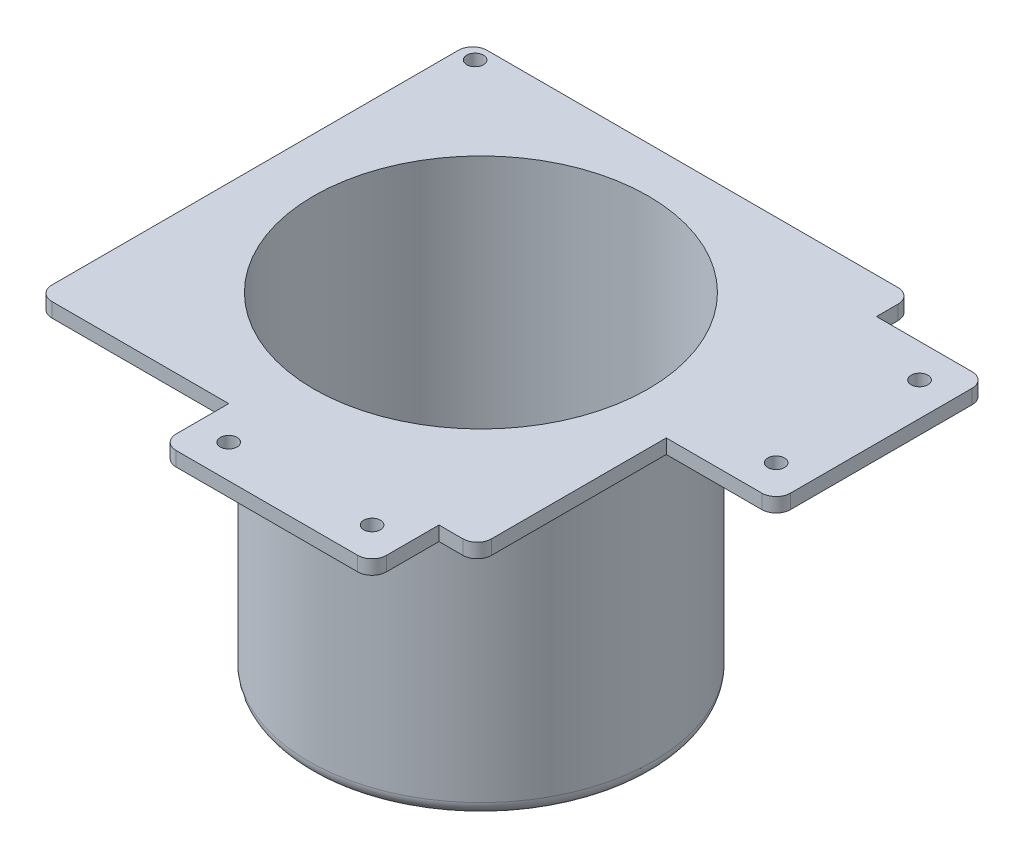
ISO-10303-21;
HEADER;
FILE_DESCRIPTION(('STEP AP214'),'2;1');
FILE_NAME('part.step','',(''),(''),'','','');
FILE_SCHEMA(('AUTOMOTIVE_DESIGN { 1 0 10303 214 1 1 1 1 }'));
ENDSEC;
DATA;
#1=APPLICATION_CONTEXT('core data for automotive mechanical design processes');
#2=APPLICATION_PROTOCOL_DEFINITION('international standard','automotive_design',2000,#1);
#3=PRODUCT_CONTEXT('',#1,'mechanical');
#4=PRODUCT('Part','Part','',(#3));
#5=PRODUCT_RELATED_PRODUCT_CATEGORY('part','',(#4));
#6=PRODUCT_DEFINITION_FORMATION('','',#4);
#7=PRODUCT_DEFINITION_CONTEXT('part definition',#1,'design');
#8=PRODUCT_DEFINITION('design','',#6,#7);
#9=PRODUCT_DEFINITION_SHAPE('','',#8);
#10=(LENGTH_UNIT() NAMED_UNIT(*) SI_UNIT(.MILLI.,.METRE.));
#11=(NAMED_UNIT(*) PLANE_ANGLE_UNIT() SI_UNIT($,.RADIAN.));
#12=(NAMED_UNIT(*) SI_UNIT($,.STERADIAN.) SOLID_ANGLE_UNIT());
#13=UNCERTAINTY_MEASURE_WITH_UNIT(LENGTH_MEASURE(1.E-05),#10,'distance_accuracy_value','');
#14=(GEOMETRIC_REPRESENTATION_CONTEXT(3) GLOBAL_UNCERTAINTY_ASSIGNED_CONTEXT((#13)) GLOBAL_UNIT_ASSIGNED_CONTEXT((#10,
#11,#12)) REPRESENTATION_CONTEXT('',''));
#15=CARTESIAN_POINT('',(0.,0.,0.));
#16=DIRECTION('',(0.,0.,1.));
#17=DIRECTION('',(1.,0.,0.));
#18=AXIS2_PLACEMENT_3D('',#15,#16,#17);
#19=CARTESIAN_POINT('',(0.,-3.,-91.06));
#20=DIRECTION('',(0.,0.,-1.));
#21=DIRECTION('',(-1.,0.,0.));
#22=AXIS2_PLACEMENT_3D('',#19,#20,#21);
#23=PLANE('',#22);
#24=DIRECTION('',(-1.,0.,0.));
#25=VECTOR('',#24,1.);
#26=CARTESIAN_POINT('',(0.,0.,-91.06));
#27=LINE('',#26,#25);
#28=CARTESIAN_POINT('',(89.,0.,-91.06));
#29=VERTEX_POINT('',#28);
#30=CARTESIAN_POINT('',(3.,0.,-91.06));
#31=VERTEX_POINT('',#30);
#32=EDGE_CURVE('E228',#29,#31,#27,.T.);
#33=ORIENTED_EDGE('',*,*,#32,.F.);
#34=DIRECTION('',(0.,1.,0.));
#35=VECTOR('',#34,1.);
#36=CARTESIAN_POINT('',(89.,-3.,-91.06));
#37=LINE('',#36,#35);
#38=CARTESIAN_POINT('',(89.,-3.,-91.06));
#39=VERTEX_POINT('',#38);
#40=EDGE_CURVE('E54',#29,#39,#37,.F.);
#41=ORIENTED_EDGE('',*,*,#40,.T.);
#42=DIRECTION('',(-1.,0.,0.));
#43=VECTOR('',#42,1.);
#44=CARTESIAN_POINT('',(0.,-3.,-91.06));
#45=LINE('',#44,#43);
#46=CARTESIAN_POINT('',(3.,-3.,-91.06));
#47=VERTEX_POINT('',#46);
#48=EDGE_CURVE('E257',#39,#47,#45,.T.);
#49=ORIENTED_EDGE('',*,*,#48,.T.);
#50=DIRECTION('',(0.,1.,0.));
#51=VECTOR('',#50,1.);
#52=CARTESIAN_POINT('',(3.,-3.,-91.06));
#53=LINE('',#52,#51);
#54=EDGE_CURVE('E261',#47,#31,#53,.T.);
#55=ORIENTED_EDGE('',*,*,#54,.T.);
#56=EDGE_LOOP('',(#33,#41,#49,#55));
#57=FACE_BOUND('',#56,.T.);
#58=ADVANCED_FACE('F39',(#57),#23,.T.);
#59=CARTESIAN_POINT('',(92.,-3.,-91.06));
#60=DIRECTION('',(1.,0.,0.));
#61=DIRECTION('',(0.,0.,-1.));
#62=AXIS2_PLACEMENT_3D('',#59,#60,#61);
#63=PLANE('',#62);
#64=DIRECTION('',(0.,0.,-1.));
#65=VECTOR('',#64,1.);
#66=CARTESIAN_POINT('',(92.,-3.,-91.06));
#67=LINE('',#66,#65);
#68=CARTESIAN_POINT('',(92.,-3.,-83.56));
#69=VERTEX_POINT('',#68);
#70=CARTESIAN_POINT('',(92.,-3.,-88.06));
#71=VERTEX_POINT('',#70);
#72=EDGE_CURVE('E198',#69,#71,#67,.T.);
#73=ORIENTED_EDGE('',*,*,#72,.T.);
#74=DIRECTION('',(0.,1.,0.));
#75=VECTOR('',#74,1.);
#76=CARTESIAN_POINT('',(92.,-3.,-88.06));
#77=LINE('',#76,#75);
#78=CARTESIAN_POINT('',(92.,0.,-88.06));
#79=VERTEX_POINT('',#78);
#80=EDGE_CURVE('E327',#71,#79,#77,.T.);
#81=ORIENTED_EDGE('',*,*,#80,.T.);
#82=DIRECTION('',(0.,0.,-1.));
#83=VECTOR('',#82,1.);
#84=CARTESIAN_POINT('',(92.,0.,-91.06));
#85=LINE('',#84,#83);
#86=CARTESIAN_POINT('',(92.,0.,-83.56));
#87=VERTEX_POINT('',#86);
#88=EDGE_CURVE('E255',#87,#79,#85,.T.);
#89=ORIENTED_EDGE('',*,*,#88,.F.);
#90=DIRECTION('',(0.,1.,0.));
#91=VECTOR('',#90,1.);
#92=CARTESIAN_POINT('',(92.,-3.,-83.56));
#93=LINE('',#92,#91);
#94=EDGE_CURVE('E258',#69,#87,#93,.T.);
#95=ORIENTED_EDGE('',*,*,#94,.F.);
#96=EDGE_LOOP('',(#73,#81,#89,#95));
#97=FACE_BOUND('',#96,.T.);
#98=ADVANCED_FACE('F352',(#97),#63,.T.);
#99=CARTESIAN_POINT('',(92.,-3.,-83.56));
#100=DIRECTION('',(0.,0.,-1.));
#101=DIRECTION('',(-1.,0.,0.));
#102=AXIS2_PLACEMENT_3D('',#99,#100,#101);
#103=PLANE('',#102);
#104=DIRECTION('',(-1.,0.,0.));
#105=VECTOR('',#104,1.);
#106=CARTESIAN_POINT('',(92.,0.,-83.56));
#107=LINE('',#106,#105);
#108=CARTESIAN_POINT('',(112.,0.,-83.56));
#109=VERTEX_POINT('',#108);
#110=EDGE_CURVE('E253',#109,#87,#107,.T.);
#111=ORIENTED_EDGE('',*,*,#110,.F.);
#112=DIRECTION('',(0.,1.,0.));
#113=VECTOR('',#112,1.);
#114=CARTESIAN_POINT('',(112.,-3.,-83.56));
#115=LINE('',#114,#113);
#116=CARTESIAN_POINT('',(112.,-3.,-83.56));
#117=VERTEX_POINT('',#116);
#118=EDGE_CURVE('E323',#109,#117,#115,.F.);
#119=ORIENTED_EDGE('',*,*,#118,.T.);
#120=DIRECTION('',(-1.,0.,0.));
#121=VECTOR('',#120,1.);
#122=CARTESIAN_POINT('',(92.,-3.,-83.56));
#123=LINE('',#122,#121);
#124=EDGE_CURVE('E224',#117,#69,#123,.T.);
#125=ORIENTED_EDGE('',*,*,#124,.T.);
#126=ORIENTED_EDGE('',*,*,#94,.T.);
#127=EDGE_LOOP('',(#111,#119,#125,#126));
#128=FACE_BOUND('',#127,.T.);
#129=ADVANCED_FACE('F358',(#128),#103,.T.);
#130=CARTESIAN_POINT('',(115.,-3.,-83.56));
#131=DIRECTION('',(1.,0.,0.));
#132=DIRECTION('',(0.,0.,-1.));
#133=AXIS2_PLACEMENT_3D('',#130,#131,#132);
#134=PLANE('',#133);
#135=DIRECTION('',(0.,0.,-1.));
#136=VECTOR('',#135,1.);
#137=CARTESIAN_POINT('',(115.,-3.,-83.56));
#138=LINE('',#137,#136);
#139=CARTESIAN_POINT('',(115.,-3.,-42.56));
#140=VERTEX_POINT('',#139);
#141=CARTESIAN_POINT('',(115.,-3.,-80.56));
#142=VERTEX_POINT('',#141);
#143=EDGE_CURVE('E221',#140,#142,#138,.T.);
#144=ORIENTED_EDGE('',*,*,#143,.T.);
#145=DIRECTION('',(0.,1.,0.));
#146=VECTOR('',#145,1.);
#147=CARTESIAN_POINT('',(115.,-3.,-80.56));
#148=LINE('',#147,#146);
#149=CARTESIAN_POINT('',(115.,0.,-80.56));
#150=VERTEX_POINT('',#149);
#151=EDGE_CURVE('E318',#142,#150,#148,.T.);
#152=ORIENTED_EDGE('',*,*,#151,.T.);
#153=DIRECTION('',(0.,0.,-1.));
#154=VECTOR('',#153,1.);
#155=CARTESIAN_POINT('',(115.,0.,-83.56));
#156=LINE('',#155,#154);
#157=CARTESIAN_POINT('',(115.,0.,-42.56));
#158=VERTEX_POINT('',#157);
#159=EDGE_CURVE('E250',#158,#150,#156,.T.);
#160=ORIENTED_EDGE('',*,*,#159,.F.);
#161=DIRECTION('',(0.,1.,0.));
#162=VECTOR('',#161,1.);
#163=CARTESIAN_POINT('',(115.,-3.,-42.56));
#164=LINE('',#163,#162);
#165=EDGE_CURVE('E314',#158,#140,#164,.F.);
#166=ORIENTED_EDGE('',*,*,#165,.T.);
#167=EDGE_LOOP('',(#144,#152,#160,#166));
#168=FACE_BOUND('',#167,.T.);
#169=ADVANCED_FACE('F411',(#168),#134,.T.);
#170=CARTESIAN_POINT('',(115.,-3.,-39.56));
#171=DIRECTION('',(0.,0.,1.));
#172=DIRECTION('',(1.,0.,0.));
#173=AXIS2_PLACEMENT_3D('',#170,#171,#172);
#174=PLANE('',#173);
#175=DIRECTION('',(1.,0.,0.));
#176=VECTOR('',#175,1.);
#177=CARTESIAN_POINT('',(115.,-3.,-39.56));
#178=LINE('',#177,#176);
#179=CARTESIAN_POINT('',(92.,-3.,-39.56));
#180=VERTEX_POINT('',#179);
#181=CARTESIAN_POINT('',(112.,-3.,-39.56));
#182=VERTEX_POINT('',#181);
#183=EDGE_CURVE('E218',#180,#182,#178,.T.);
#184=ORIENTED_EDGE('',*,*,#183,.T.);
#185=DIRECTION('',(0.,1.,0.));
#186=VECTOR('',#185,1.);
#187=CARTESIAN_POINT('',(112.,-3.,-39.56));
#188=LINE('',#187,#186);
#189=CARTESIAN_POINT('',(112.,0.,-39.56));
#190=VERTEX_POINT('',#189);
#191=EDGE_CURVE('E309',#182,#190,#188,.T.);
#192=ORIENTED_EDGE('',*,*,#191,.T.);
#193=DIRECTION('',(1.,0.,0.));
#194=VECTOR('',#193,1.);
#195=CARTESIAN_POINT('',(115.,0.,-39.56));
#196=LINE('',#195,#194);
#197=CARTESIAN_POINT('',(92.,0.,-39.56));
#198=VERTEX_POINT('',#197);
#199=EDGE_CURVE('E247',#198,#190,#196,.T.);
#200=ORIENTED_EDGE('',*,*,#199,.F.);
#201=DIRECTION('',(0.,1.,0.));
#202=VECTOR('',#201,1.);
#203=CARTESIAN_POINT('',(92.,-3.,-39.56));
#204=LINE('',#203,#202);
#205=EDGE_CURVE('E262',#180,#198,#204,.T.);
#206=ORIENTED_EDGE('',*,*,#205,.F.);
#207=EDGE_LOOP('',(#184,#192,#200,#206));
#208=FACE_BOUND('',#207,.T.);
#209=ADVANCED_FACE('F419',(#208),#174,.T.);
#210=CARTESIAN_POINT('',(92.,-3.,-39.56));
#211=DIRECTION('',(1.,0.,0.));
#212=DIRECTION('',(0.,0.,-1.));
#213=AXIS2_PLACEMENT_3D('',#210,#211,#212);
#214=PLANE('',#213);
#215=DIRECTION('',(0.,0.,-1.));
#216=VECTOR('',#215,1.);
#217=CARTESIAN_POINT('',(92.,0.,-39.56));
#218=LINE('',#217,#216);
#219=CARTESIAN_POINT('',(92.,0.,-3.00000000000002));
#220=VERTEX_POINT('',#219);
#221=EDGE_CURVE('E245',#220,#198,#218,.T.);
#222=ORIENTED_EDGE('',*,*,#221,.F.);
#223=DIRECTION('',(0.,1.,0.));
#224=VECTOR('',#223,1.);
#225=CARTESIAN_POINT('',(92.,-3.,-3.));
#226=LINE('',#225,#224);
#227=CARTESIAN_POINT('',(92.,-3.,-3.00000000000002));
#228=VERTEX_POINT('',#227);
#229=EDGE_CURVE('E296',#220,#228,#226,.F.);
#230=ORIENTED_EDGE('',*,*,#229,.T.);
#231=DIRECTION('',(0.,0.,-1.));
#232=VECTOR('',#231,1.);
#233=CARTESIAN_POINT('',(92.,-3.,-39.56));
#234=LINE('',#233,#232);
#235=EDGE_CURVE('E216',#228,#180,#234,.T.);
#236=ORIENTED_EDGE('',*,*,#235,.T.);
#237=ORIENTED_EDGE('',*,*,#205,.T.);
#238=EDGE_LOOP('',(#222,#230,#236,#237));
#239=FACE_BOUND('',#238,.T.);
#240=ADVANCED_FACE('F510',(#239),#214,.T.);
#241=CARTESIAN_POINT('',(84.,-3.,0.));
#242=DIRECTION('',(0.,0.,1.));
#243=DIRECTION('',(1.,0.,0.));
#244=AXIS2_PLACEMENT_3D('',#241,#242,#243);
#245=PLANE('',#244);
#246=DIRECTION('',(1.,0.,0.));
#247=VECTOR('',#246,1.);
#248=CARTESIAN_POINT('',(84.,-3.,0.));
#249=LINE('',#248,#247);
#250=CARTESIAN_POINT('',(84.,-3.,0.));
#251=VERTEX_POINT('',#250);
#252=CARTESIAN_POINT('',(89.,-3.,0.));
#253=VERTEX_POINT('',#252);
#254=EDGE_CURVE('E213',#251,#253,#249,.T.);
#255=ORIENTED_EDGE('',*,*,#254,.T.);
#256=DIRECTION('',(0.,1.,0.));
#257=VECTOR('',#256,1.);
#258=CARTESIAN_POINT('',(89.,-3.,0.));
#259=LINE('',#258,#257);
#260=CARTESIAN_POINT('',(89.,0.,0.));
#261=VERTEX_POINT('',#260);
#262=EDGE_CURVE('E291',#253,#261,#259,.T.);
#263=ORIENTED_EDGE('',*,*,#262,.T.);
#264=DIRECTION('',(1.,0.,0.));
#265=VECTOR('',#264,1.);
#266=CARTESIAN_POINT('',(84.,0.,0.));
#267=LINE('',#266,#265);
#268=CARTESIAN_POINT('',(84.,0.,0.));
#269=VERTEX_POINT('',#268);
#270=EDGE_CURVE('E242',#269,#261,#267,.T.);
#271=ORIENTED_EDGE('',*,*,#270,.F.);
#272=DIRECTION('',(0.,1.,0.));
#273=VECTOR('',#272,1.);
#274=CARTESIAN_POINT('',(84.,-3.,0.));
#275=LINE('',#274,#273);
#276=EDGE_CURVE('E197',#251,#269,#275,.T.);
#277=ORIENTED_EDGE('',*,*,#276,.F.);
#278=EDGE_LOOP('',(#255,#263,#271,#277));
#279=FACE_BOUND('',#278,.T.);
#280=ADVANCED_FACE('F430',(#279),#245,.T.);
#281=CARTESIAN_POINT('',(84.,-3.,0.));
#282=DIRECTION('',(1.,0.,0.));
#283=DIRECTION('',(0.,0.,-1.));
#284=AXIS2_PLACEMENT_3D('',#281,#282,#283);
#285=PLANE('',#284);
#286=DIRECTION('',(0.,0.,-1.));
#287=VECTOR('',#286,1.);
#288=CARTESIAN_POINT('',(84.,0.,0.));
#289=LINE('',#288,#287);
#290=CARTESIAN_POINT('',(84.,0.,11.));
#291=VERTEX_POINT('',#290);
#292=EDGE_CURVE('E240',#291,#269,#289,.T.);
#293=ORIENTED_EDGE('',*,*,#292,.F.);
#294=DIRECTION('',(0.,1.,0.));
#295=VECTOR('',#294,1.);
#296=CARTESIAN_POINT('',(84.,-3.,11.));
#297=LINE('',#296,#295);
#298=CARTESIAN_POINT('',(84.,-3.,11.));
#299=VERTEX_POINT('',#298);
#300=EDGE_CURVE('E305',#291,#299,#297,.F.);
#301=ORIENTED_EDGE('',*,*,#300,.T.);
#302=DIRECTION('',(0.,0.,-1.));
#303=VECTOR('',#302,1.);
#304=CARTESIAN_POINT('',(84.,-3.,0.));
#305=LINE('',#304,#303);
#306=EDGE_CURVE('E208',#299,#251,#305,.T.);
#307=ORIENTED_EDGE('',*,*,#306,.T.);
#308=ORIENTED_EDGE('',*,*,#276,.T.);
#309=EDGE_LOOP('',(#293,#301,#307,#308));
#310=FACE_BOUND('',#309,.T.);
#311=ADVANCED_FACE('F436',(#310),#285,.T.);
#312=CARTESIAN_POINT('',(40.,-3.,14.));
#313=DIRECTION('',(0.,0.,1.));
#314=DIRECTION('',(1.,0.,0.));
#315=AXIS2_PLACEMENT_3D('',#312,#313,#314);
#316=PLANE('',#315);
#317=DIRECTION('',(1.,0.,0.));
#318=VECTOR('',#317,1.);
#319=CARTESIAN_POINT('',(40.,-3.,14.));
#320=LINE('',#319,#318);
#321=CARTESIAN_POINT('',(43.,-3.,14.));
#322=VERTEX_POINT('',#321);
#323=CARTESIAN_POINT('',(81.,-3.,14.));
#324=VERTEX_POINT('',#323);
#325=EDGE_CURVE('E205',#322,#324,#320,.T.);
#326=ORIENTED_EDGE('',*,*,#325,.T.);
#327=DIRECTION('',(0.,1.,0.));
#328=VECTOR('',#327,1.);
#329=CARTESIAN_POINT('',(81.,-3.,14.));
#330=LINE('',#329,#328);
#331=CARTESIAN_POINT('',(81.,0.,14.));
#332=VERTEX_POINT('',#331);
#333=EDGE_CURVE('E300',#324,#332,#330,.T.);
#334=ORIENTED_EDGE('',*,*,#333,.T.);
#335=DIRECTION('',(1.,0.,0.));
#336=VECTOR('',#335,1.);
#337=CARTESIAN_POINT('',(40.,0.,14.));
#338=LINE('',#337,#336);
#339=CARTESIAN_POINT('',(43.,0.,14.));
#340=VERTEX_POINT('',#339);
#341=EDGE_CURVE('E237',#340,#332,#338,.T.);
#342=ORIENTED_EDGE('',*,*,#341,.F.);
#343=DIRECTION('',(0.,1.,0.));
#344=VECTOR('',#343,1.);
#345=CARTESIAN_POINT('',(43.,-3.,14.));
#346=LINE('',#345,#344);
#347=EDGE_CURVE('E280',#340,#322,#346,.F.);
#348=ORIENTED_EDGE('',*,*,#347,.T.);
#349=EDGE_LOOP('',(#326,#334,#342,#348));
#350=FACE_BOUND('',#349,.T.);
#351=ADVANCED_FACE('F442',(#350),#316,.T.);
#352=CARTESIAN_POINT('',(40.,-3.,0.));
#353=DIRECTION('',(-1.,0.,0.));
#354=DIRECTION('',(0.,0.,1.));
#355=AXIS2_PLACEMENT_3D('',#352,#353,#354);
#356=PLANE('',#355);
#357=DIRECTION('',(0.,0.,1.));
#358=VECTOR('',#357,1.);
#359=CARTESIAN_POINT('',(40.,-3.,0.));
#360=LINE('',#359,#358);
#361=CARTESIAN_POINT('',(40.,-3.,0.));
#362=VERTEX_POINT('',#361);
#363=CARTESIAN_POINT('',(40.,-3.,11.));
#364=VERTEX_POINT('',#363);
#365=EDGE_CURVE('E187',#362,#364,#360,.T.);
#366=ORIENTED_EDGE('',*,*,#365,.T.);
#367=DIRECTION('',(0.,1.,0.));
#368=VECTOR('',#367,1.);
#369=CARTESIAN_POINT('',(40.,-3.,11.));
#370=LINE('',#369,#368);
#371=CARTESIAN_POINT('',(40.,0.,11.));
#372=VERTEX_POINT('',#371);
#373=EDGE_CURVE('E276',#364,#372,#370,.T.);
#374=ORIENTED_EDGE('',*,*,#373,.T.);
#375=DIRECTION('',(0.,0.,1.));
#376=VECTOR('',#375,1.);
#377=CARTESIAN_POINT('',(40.,0.,0.));
#378=LINE('',#377,#376);
#379=CARTESIAN_POINT('',(40.,0.,0.));
#380=VERTEX_POINT('',#379);
#381=EDGE_CURVE('E196',#380,#372,#378,.T.);
#382=ORIENTED_EDGE('',*,*,#381,.F.);
#383=DIRECTION('',(0.,1.,0.));
#384=VECTOR('',#383,1.);
#385=CARTESIAN_POINT('',(40.,-3.,0.));
#386=LINE('',#385,#384);
#387=EDGE_CURVE('E180',#362,#380,#386,.T.);
#388=ORIENTED_EDGE('',*,*,#387,.F.);
#389=EDGE_LOOP('',(#366,#374,#382,#388));
#390=FACE_BOUND('',#389,.T.);
#391=ADVANCED_FACE('F192',(#390),#356,.T.);
#392=CARTESIAN_POINT('',(0.,-3.,0.));
#393=DIRECTION('',(0.,0.,1.));
#394=DIRECTION('',(1.,0.,0.));
#395=AXIS2_PLACEMENT_3D('',#392,#393,#394);
#396=PLANE('',#395);
#397=DIRECTION('',(1.,0.,0.));
#398=VECTOR('',#397,1.);
#399=CARTESIAN_POINT('',(0.,0.,0.));
#400=LINE('',#399,#398);
#401=CARTESIAN_POINT('',(3.,0.,0.));
#402=VERTEX_POINT('',#401);
#403=EDGE_CURVE('E234',#402,#380,#400,.T.);
#404=ORIENTED_EDGE('',*,*,#403,.F.);
#405=DIRECTION('',(0.,1.,0.));
#406=VECTOR('',#405,1.);
#407=CARTESIAN_POINT('',(3.,-3.,0.));
#408=LINE('',#407,#406);
#409=CARTESIAN_POINT('',(3.,-3.,0.));
#410=VERTEX_POINT('',#409);
#411=EDGE_CURVE('E183',#402,#410,#408,.F.);
#412=ORIENTED_EDGE('',*,*,#411,.T.);
#413=DIRECTION('',(1.,0.,0.));
#414=VECTOR('',#413,1.);
#415=CARTESIAN_POINT('',(0.,-3.,0.));
#416=LINE('',#415,#414);
#417=EDGE_CURVE('E176',#410,#362,#416,.T.);
#418=ORIENTED_EDGE('',*,*,#417,.T.);
#419=ORIENTED_EDGE('',*,*,#387,.T.);
#420=EDGE_LOOP('',(#404,#412,#418,#419));
#421=FACE_BOUND('',#420,.T.);
#422=ADVANCED_FACE('F179',(#421),#396,.T.);
#423=CARTESIAN_POINT('',(0.,-3.,-91.06));
#424=DIRECTION('',(-1.,0.,0.));
#425=DIRECTION('',(0.,0.,1.));
#426=AXIS2_PLACEMENT_3D('',#423,#424,#425);
#427=PLANE('',#426);
#428=DIRECTION('',(0.,0.,1.));
#429=VECTOR('',#428,1.);
#430=CARTESIAN_POINT('',(0.,-3.,-91.06));
#431=LINE('',#430,#429);
#432=CARTESIAN_POINT('',(0.,-3.,-88.06));
#433=VERTEX_POINT('',#432);
#434=CARTESIAN_POINT('',(0.,-3.,-3.));
#435=VERTEX_POINT('',#434);
#436=EDGE_CURVE('E188',#433,#435,#431,.T.);
#437=ORIENTED_EDGE('',*,*,#436,.T.);
#438=DIRECTION('',(0.,1.,0.));
#439=VECTOR('',#438,1.);
#440=CARTESIAN_POINT('',(0.,-3.,-3.));
#441=LINE('',#440,#439);
#442=CARTESIAN_POINT('',(0.,0.,-3.));
#443=VERTEX_POINT('',#442);
#444=EDGE_CURVE('E283',#435,#443,#441,.T.);
#445=ORIENTED_EDGE('',*,*,#444,.T.);
#446=DIRECTION('',(0.,0.,1.));
#447=VECTOR('',#446,1.);
#448=CARTESIAN_POINT('',(0.,0.,-91.06));
#449=LINE('',#448,#447);
#450=CARTESIAN_POINT('',(0.,0.,-88.06));
#451=VERTEX_POINT('',#450);
#452=EDGE_CURVE('E230',#451,#443,#449,.T.);
#453=ORIENTED_EDGE('',*,*,#452,.F.);
#454=DIRECTION('',(0.,1.,0.));
#455=VECTOR('',#454,1.);
#456=CARTESIAN_POINT('',(0.,-3.,-88.06));
#457=LINE('',#456,#455);
#458=EDGE_CURVE('E271',#451,#433,#457,.F.);
#459=ORIENTED_EDGE('',*,*,#458,.T.);
#460=EDGE_LOOP('',(#437,#445,#453,#459));
#461=FACE_BOUND('',#460,.T.);
#462=ADVANCED_FACE('F363',(#461),#427,.T.);
#463=CARTESIAN_POINT('',(0.,-3.,0.));
#464=DIRECTION('',(0.,-1.,0.));
#465=DIRECTION('',(0.,0.,-1.));
#466=AXIS2_PLACEMENT_3D('',#463,#464,#465);
#467=PLANE('',#466);
#468=CARTESIAN_POINT('',(47.,-3.,7.00000000000001));
#469=DIRECTION('',(0.,1.,0.));
#470=DIRECTION('',(0.,0.,1.));
#471=AXIS2_PLACEMENT_3D('',#468,#469,#470);
#472=CIRCLE('',#471,1.75);
#473=CARTESIAN_POINT('',(47.,-3.,8.75000000000002));
#474=VERTEX_POINT('',#473);
#475=EDGE_CURVE('E474',#474,#474,#472,.T.);
#476=ORIENTED_EDGE('',*,*,#475,.T.);
#477=EDGE_LOOP('',(#476));
#478=FACE_BOUND('',#477,.T.);
#479=CARTESIAN_POINT('',(77.,-3.,7.00000000000001));
#480=DIRECTION('',(0.,1.,0.));
#481=DIRECTION('',(0.,0.,1.));
#482=AXIS2_PLACEMENT_3D('',#479,#480,#481);
#483=CIRCLE('',#482,1.75);
#484=CARTESIAN_POINT('',(77.,-3.,8.75000000000001));
#485=VERTEX_POINT('',#484);
#486=EDGE_CURVE('E468',#485,#485,#483,.T.);
#487=ORIENTED_EDGE('',*,*,#486,.T.);
#488=EDGE_LOOP('',(#487));
#489=FACE_BOUND('',#488,.T.);
#490=CARTESIAN_POINT('',(3.5,-3.,-88.06));
#491=DIRECTION('',(0.,1.,0.));
#492=DIRECTION('',(0.,0.,1.));
#493=AXIS2_PLACEMENT_3D('',#490,#491,#492);
#494=CIRCLE('',#493,1.75);
#495=CARTESIAN_POINT('',(3.5,-3.,-86.31));
#496=VERTEX_POINT('',#495);
#497=EDGE_CURVE('E462',#496,#496,#494,.T.);
#498=ORIENTED_EDGE('',*,*,#497,.T.);
#499=EDGE_LOOP('',(#498));
#500=FACE_BOUND('',#499,.T.);
#501=CARTESIAN_POINT('',(108.,-3.,-76.56));
#502=DIRECTION('',(0.,1.,0.));
#503=DIRECTION('',(0.,0.,1.));
#504=AXIS2_PLACEMENT_3D('',#501,#502,#503);
#505=CIRCLE('',#504,1.75);
#506=CARTESIAN_POINT('',(108.,-3.,-74.81));
#507=VERTEX_POINT('',#506);
#508=EDGE_CURVE('E456',#507,#507,#505,.T.);
#509=ORIENTED_EDGE('',*,*,#508,.T.);
#510=EDGE_LOOP('',(#509));
#511=FACE_BOUND('',#510,.T.);
#512=CARTESIAN_POINT('',(108.,-3.,-46.56));
#513=DIRECTION('',(0.,1.,0.));
#514=DIRECTION('',(0.,0.,1.));
#515=AXIS2_PLACEMENT_3D('',#512,#513,#514);
#516=CIRCLE('',#515,1.75);
#517=CARTESIAN_POINT('',(108.,-3.,-44.81));
#518=VERTEX_POINT('',#517);
#519=EDGE_CURVE('E231',#518,#518,#516,.T.);
#520=ORIENTED_EDGE('',*,*,#519,.T.);
#521=EDGE_LOOP('',(#520));
#522=FACE_BOUND('',#521,.T.);
#523=ORIENTED_EDGE('',*,*,#48,.F.);
#524=CARTESIAN_POINT('',(89.,-3.,-88.06));
#525=DIRECTION('',(0.,-1.,0.));
#526=DIRECTION('',(0.,0.,-1.));
#527=AXIS2_PLACEMENT_3D('',#524,#525,#526);
#528=CIRCLE('',#527,3.);
#529=EDGE_CURVE('E332',#39,#71,#528,.T.);
#530=ORIENTED_EDGE('',*,*,#529,.T.);
#531=ORIENTED_EDGE('',*,*,#72,.F.);
#532=ORIENTED_EDGE('',*,*,#124,.F.);
#533=CARTESIAN_POINT('',(112.,-3.,-80.56));
#534=DIRECTION('',(0.,-1.,0.));
#535=DIRECTION('',(0.,0.,-1.));
#536=AXIS2_PLACEMENT_3D('',#533,#534,#535);
#537=CIRCLE('',#536,3.);
#538=EDGE_CURVE('E325',#117,#142,#537,.T.);
#539=ORIENTED_EDGE('',*,*,#538,.T.);
#540=ORIENTED_EDGE('',*,*,#143,.F.);
#541=CARTESIAN_POINT('',(112.,-3.,-42.56));
#542=DIRECTION('',(0.,-1.,0.));
#543=DIRECTION('',(0.,0.,-1.));
#544=AXIS2_PLACEMENT_3D('',#541,#542,#543);
#545=CIRCLE('',#544,3.);
#546=EDGE_CURVE('E316',#140,#182,#545,.T.);
#547=ORIENTED_EDGE('',*,*,#546,.T.);
#548=ORIENTED_EDGE('',*,*,#183,.F.);
#549=ORIENTED_EDGE('',*,*,#235,.F.);
#550=CARTESIAN_POINT('',(89.,-3.,-3.));
#551=DIRECTION('',(0.,-1.,0.));
#552=DIRECTION('',(0.,0.,-1.));
#553=AXIS2_PLACEMENT_3D('',#550,#551,#552);
#554=CIRCLE('',#553,3.);
#555=EDGE_CURVE('E298',#228,#253,#554,.T.);
#556=ORIENTED_EDGE('',*,*,#555,.T.);
#557=ORIENTED_EDGE('',*,*,#254,.F.);
#558=ORIENTED_EDGE('',*,*,#306,.F.);
#559=CARTESIAN_POINT('',(81.,-3.,11.));
#560=DIRECTION('',(0.,-1.,0.));
#561=DIRECTION('',(0.,0.,-1.));
#562=AXIS2_PLACEMENT_3D('',#559,#560,#561);
#563=CIRCLE('',#562,3.);
#564=EDGE_CURVE('E307',#299,#324,#563,.T.);
#565=ORIENTED_EDGE('',*,*,#564,.T.);
#566=ORIENTED_EDGE('',*,*,#325,.F.);
#567=CARTESIAN_POINT('',(43.,-3.,11.));
#568=DIRECTION('',(0.,-1.,0.));
#569=DIRECTION('',(0.,0.,-1.));
#570=AXIS2_PLACEMENT_3D('',#567,#568,#569);
#571=CIRCLE('',#570,3.);
#572=EDGE_CURVE('E204',#322,#364,#571,.T.);
#573=ORIENTED_EDGE('',*,*,#572,.T.);
#574=ORIENTED_EDGE('',*,*,#365,.F.);
#575=ORIENTED_EDGE('',*,*,#417,.F.);
#576=CARTESIAN_POINT('',(3.,-3.,-3.));
#577=DIRECTION('',(0.,-1.,0.));
#578=DIRECTION('',(0.,0.,-1.));
#579=AXIS2_PLACEMENT_3D('',#576,#577,#578);
#580=CIRCLE('',#579,3.);
#581=EDGE_CURVE('E289',#410,#435,#580,.T.);
#582=ORIENTED_EDGE('',*,*,#581,.T.);
#583=ORIENTED_EDGE('',*,*,#436,.F.);
#584=CARTESIAN_POINT('',(3.,-3.,-88.06));
#585=DIRECTION('',(0.,-1.,0.));
#586=DIRECTION('',(0.,0.,-1.));
#587=AXIS2_PLACEMENT_3D('',#584,#585,#586);
#588=CIRCLE('',#587,3.);
#589=EDGE_CURVE('E273',#433,#47,#588,.T.);
#590=ORIENTED_EDGE('',*,*,#589,.T.);
#591=EDGE_LOOP('',(#523,#530,#531,#532,#539,#540,#547,#548,#549,#556,#557,#558,#565,#566,#573,
#574,#575,#582,#583,#590));
#592=FACE_BOUND('',#591,.T.);
#593=CARTESIAN_POINT('',(46.25,-3.,-46.53));
#594=DIRECTION('',(0.,-1.,0.));
#595=DIRECTION('',(0.,0.,-1.));
#596=AXIS2_PLACEMENT_3D('',#593,#594,#595);
#597=CIRCLE('',#596,36.000000000703);
#598=CARTESIAN_POINT('',(46.25,-3.,-82.530000000703));
#599=VERTEX_POINT('',#598);
#600=EDGE_CURVE('E486',#599,#599,#597,.T.);
#601=ORIENTED_EDGE('',*,*,#600,.F.);
#602=EDGE_LOOP('',(#601));
#603=FACE_BOUND('',#602,.T.);
#604=ADVANCED_FACE('F200',(#478,#489,#500,#511,#522,#592,#603),#467,.T.);
#605=CARTESIAN_POINT('',(0.,0.,0.));
#606=DIRECTION('',(0.,-1.,0.));
#607=DIRECTION('',(0.,0.,-1.));
#608=AXIS2_PLACEMENT_3D('',#605,#606,#607);
#609=PLANE('',#608);
#610=CARTESIAN_POINT('',(47.,0.,7.00000000000001));
#611=DIRECTION('',(0.,1.,0.));
#612=DIRECTION('',(0.,0.,1.));
#613=AXIS2_PLACEMENT_3D('',#610,#611,#612);
#614=CIRCLE('',#613,1.75);
#615=CARTESIAN_POINT('',(47.,0.,8.75000000000002));
#616=VERTEX_POINT('',#615);
#617=EDGE_CURVE('E477',#616,#616,#614,.T.);
#618=ORIENTED_EDGE('',*,*,#617,.F.);
#619=EDGE_LOOP('',(#618));
#620=FACE_BOUND('',#619,.T.);
#621=CARTESIAN_POINT('',(77.,0.,7.00000000000001));
#622=DIRECTION('',(0.,1.,0.));
#623=DIRECTION('',(0.,0.,1.));
#624=AXIS2_PLACEMENT_3D('',#621,#622,#623);
#625=CIRCLE('',#624,1.75);
#626=CARTESIAN_POINT('',(77.,0.,8.75000000000001));
#627=VERTEX_POINT('',#626);
#628=EDGE_CURVE('E471',#627,#627,#625,.T.);
#629=ORIENTED_EDGE('',*,*,#628,.F.);
#630=EDGE_LOOP('',(#629));
#631=FACE_BOUND('',#630,.T.);
#632=CARTESIAN_POINT('',(3.5,0.,-88.06));
#633=DIRECTION('',(0.,1.,0.));
#634=DIRECTION('',(0.,0.,1.));
#635=AXIS2_PLACEMENT_3D('',#632,#633,#634);
#636=CIRCLE('',#635,1.75);
#637=CARTESIAN_POINT('',(3.5,0.,-86.31));
#638=VERTEX_POINT('',#637);
#639=EDGE_CURVE('E465',#638,#638,#636,.T.);
#640=ORIENTED_EDGE('',*,*,#639,.F.);
#641=EDGE_LOOP('',(#640));
#642=FACE_BOUND('',#641,.T.);
#643=CARTESIAN_POINT('',(108.,0.,-76.56));
#644=DIRECTION('',(0.,1.,0.));
#645=DIRECTION('',(0.,0.,1.));
#646=AXIS2_PLACEMENT_3D('',#643,#644,#645);
#647=CIRCLE('',#646,1.75);
#648=CARTESIAN_POINT('',(108.,0.,-74.81));
#649=VERTEX_POINT('',#648);
#650=EDGE_CURVE('E459',#649,#649,#647,.T.);
#651=ORIENTED_EDGE('',*,*,#650,.F.);
#652=EDGE_LOOP('',(#651));
#653=FACE_BOUND('',#652,.T.);
#654=CARTESIAN_POINT('',(108.,0.,-46.56));
#655=DIRECTION('',(0.,1.,0.));
#656=DIRECTION('',(0.,0.,1.));
#657=AXIS2_PLACEMENT_3D('',#654,#655,#656);
#658=CIRCLE('',#657,1.75);
#659=CARTESIAN_POINT('',(108.,0.,-44.81));
#660=VERTEX_POINT('',#659);
#661=EDGE_CURVE('E453',#660,#660,#658,.T.);
#662=ORIENTED_EDGE('',*,*,#661,.F.);
#663=EDGE_LOOP('',(#662));
#664=FACE_BOUND('',#663,.T.);
#665=ORIENTED_EDGE('',*,*,#88,.T.);
#666=CARTESIAN_POINT('',(89.,0.,-88.06));
#667=DIRECTION('',(0.,-1.,0.));
#668=DIRECTION('',(0.,0.,-1.));
#669=AXIS2_PLACEMENT_3D('',#666,#667,#668);
#670=CIRCLE('',#669,3.);
#671=EDGE_CURVE('E62',#79,#29,#670,.F.);
#672=ORIENTED_EDGE('',*,*,#671,.T.);
#673=ORIENTED_EDGE('',*,*,#32,.T.);
#674=CARTESIAN_POINT('',(3.,0.,-88.06));
#675=DIRECTION('',(0.,-1.,0.));
#676=DIRECTION('',(0.,0.,-1.));
#677=AXIS2_PLACEMENT_3D('',#674,#675,#676);
#678=CIRCLE('',#677,3.);
#679=EDGE_CURVE('E269',#31,#451,#678,.F.);
#680=ORIENTED_EDGE('',*,*,#679,.T.);
#681=ORIENTED_EDGE('',*,*,#452,.T.);
#682=CARTESIAN_POINT('',(3.,0.,-3.));
#683=DIRECTION('',(0.,-1.,0.));
#684=DIRECTION('',(0.,0.,-1.));
#685=AXIS2_PLACEMENT_3D('',#682,#683,#684);
#686=CIRCLE('',#685,3.);
#687=EDGE_CURVE('E286',#443,#402,#686,.F.);
#688=ORIENTED_EDGE('',*,*,#687,.T.);
#689=ORIENTED_EDGE('',*,*,#403,.T.);
#690=ORIENTED_EDGE('',*,*,#381,.T.);
#691=CARTESIAN_POINT('',(43.,0.,11.));
#692=DIRECTION('',(0.,-1.,0.));
#693=DIRECTION('',(0.,0.,-1.));
#694=AXIS2_PLACEMENT_3D('',#691,#692,#693);
#695=CIRCLE('',#694,3.);
#696=EDGE_CURVE('E278',#372,#340,#695,.F.);
#697=ORIENTED_EDGE('',*,*,#696,.T.);
#698=ORIENTED_EDGE('',*,*,#341,.T.);
#699=CARTESIAN_POINT('',(81.,0.,11.));
#700=DIRECTION('',(0.,-1.,0.));
#701=DIRECTION('',(0.,0.,-1.));
#702=AXIS2_PLACEMENT_3D('',#699,#700,#701);
#703=CIRCLE('',#702,3.);
#704=EDGE_CURVE('E303',#332,#291,#703,.F.);
#705=ORIENTED_EDGE('',*,*,#704,.T.);
#706=ORIENTED_EDGE('',*,*,#292,.T.);
#707=ORIENTED_EDGE('',*,*,#270,.T.);
#708=CARTESIAN_POINT('',(89.,0.,-3.));
#709=DIRECTION('',(0.,-1.,0.));
#710=DIRECTION('',(0.,0.,-1.));
#711=AXIS2_PLACEMENT_3D('',#708,#709,#710);
#712=CIRCLE('',#711,3.);
#713=EDGE_CURVE('E294',#261,#220,#712,.F.);
#714=ORIENTED_EDGE('',*,*,#713,.T.);
#715=ORIENTED_EDGE('',*,*,#221,.T.);
#716=ORIENTED_EDGE('',*,*,#199,.T.);
#717=CARTESIAN_POINT('',(112.,0.,-42.56));
#718=DIRECTION('',(0.,-1.,0.));
#719=DIRECTION('',(0.,0.,-1.));
#720=AXIS2_PLACEMENT_3D('',#717,#718,#719);
#721=CIRCLE('',#720,3.);
#722=EDGE_CURVE('E312',#190,#158,#721,.F.);
#723=ORIENTED_EDGE('',*,*,#722,.T.);
#724=ORIENTED_EDGE('',*,*,#159,.T.);
#725=CARTESIAN_POINT('',(112.,0.,-80.56));
#726=DIRECTION('',(0.,-1.,0.));
#727=DIRECTION('',(0.,0.,-1.));
#728=AXIS2_PLACEMENT_3D('',#725,#726,#727);
#729=CIRCLE('',#728,3.);
#730=EDGE_CURVE('E321',#150,#109,#729,.F.);
#731=ORIENTED_EDGE('',*,*,#730,.T.);
#732=ORIENTED_EDGE('',*,*,#110,.T.);
#733=EDGE_LOOP('',(#665,#672,#673,#680,#681,#688,#689,#690,#697,#698,#705,#706,#707,#714,#715,
#716,#723,#724,#731,#732));
#734=FACE_BOUND('',#733,.T.);
#735=CARTESIAN_POINT('',(46.25,0.,-46.53));
#736=DIRECTION('',(0.,1.,0.));
#737=DIRECTION('',(0.,0.,1.));
#738=AXIS2_PLACEMENT_3D('',#735,#736,#737);
#739=CIRCLE('',#738,35.);
#740=CARTESIAN_POINT('',(46.25,0.,-11.53));
#741=VERTEX_POINT('',#740);
#742=EDGE_CURVE('E483',#741,#741,#739,.T.);
#743=ORIENTED_EDGE('',*,*,#742,.F.);
#744=EDGE_LOOP('',(#743));
#745=FACE_BOUND('',#744,.T.);
#746=ADVANCED_FACE('F413',(#620,#631,#642,#653,#664,#734,#745),#609,.F.);
#747=CARTESIAN_POINT('',(108.,-3.,-46.56));
#748=DIRECTION('',(0.,1.,0.));
#749=DIRECTION('',(0.,0.,1.));
#750=AXIS2_PLACEMENT_3D('',#747,#748,#749);
#751=CYLINDRICAL_SURFACE('',#750,1.75);
#752=ORIENTED_EDGE('',*,*,#519,.F.);
#753=EDGE_LOOP('',(#752));
#754=FACE_BOUND('',#753,.T.);
#755=ORIENTED_EDGE('',*,*,#661,.T.);
#756=EDGE_LOOP('',(#755));
#757=FACE_BOUND('',#756,.T.);
#758=ADVANCED_FACE('F496',(#754,#757),#751,.F.);
#759=CARTESIAN_POINT('',(108.,-3.,-76.56));
#760=DIRECTION('',(0.,1.,0.));
#761=DIRECTION('',(0.,0.,1.));
#762=AXIS2_PLACEMENT_3D('',#759,#760,#761);
#763=CYLINDRICAL_SURFACE('',#762,1.75);
#764=ORIENTED_EDGE('',*,*,#508,.F.);
#765=EDGE_LOOP('',(#764));
#766=FACE_BOUND('',#765,.T.);
#767=ORIENTED_EDGE('',*,*,#650,.T.);
#768=EDGE_LOOP('',(#767));
#769=FACE_BOUND('',#768,.T.);
#770=ADVANCED_FACE('F635',(#766,#769),#763,.F.);
#771=CARTESIAN_POINT('',(3.5,-3.,-88.06));
#772=DIRECTION('',(0.,1.,0.));
#773=DIRECTION('',(0.,0.,1.));
#774=AXIS2_PLACEMENT_3D('',#771,#772,#773);
#775=CYLINDRICAL_SURFACE('',#774,1.75);
#776=ORIENTED_EDGE('',*,*,#497,.F.);
#777=EDGE_LOOP('',(#776));
#778=FACE_BOUND('',#777,.T.);
#779=ORIENTED_EDGE('',*,*,#639,.T.);
#780=EDGE_LOOP('',(#779));
#781=FACE_BOUND('',#780,.T.);
#782=ADVANCED_FACE('F644',(#778,#781),#775,.F.);
#783=CARTESIAN_POINT('',(77.,-3.,7.00000000000001));
#784=DIRECTION('',(0.,1.,0.));
#785=DIRECTION('',(0.,0.,1.));
#786=AXIS2_PLACEMENT_3D('',#783,#784,#785);
#787=CYLINDRICAL_SURFACE('',#786,1.75);
#788=ORIENTED_EDGE('',*,*,#486,.F.);
#789=EDGE_LOOP('',(#788));
#790=FACE_BOUND('',#789,.T.);
#791=ORIENTED_EDGE('',*,*,#628,.T.);
#792=EDGE_LOOP('',(#791));
#793=FACE_BOUND('',#792,.T.);
#794=ADVANCED_FACE('F653',(#790,#793),#787,.F.);
#795=CARTESIAN_POINT('',(47.,-3.,7.00000000000001));
#796=DIRECTION('',(0.,1.,0.));
#797=DIRECTION('',(0.,0.,1.));
#798=AXIS2_PLACEMENT_3D('',#795,#796,#797);
#799=CYLINDRICAL_SURFACE('',#798,1.75);
#800=ORIENTED_EDGE('',*,*,#475,.F.);
#801=EDGE_LOOP('',(#800));
#802=FACE_BOUND('',#801,.T.);
#803=ORIENTED_EDGE('',*,*,#617,.T.);
#804=EDGE_LOOP('',(#803));
#805=FACE_BOUND('',#804,.T.);
#806=ADVANCED_FACE('F662',(#802,#805),#799,.F.);
#807=CARTESIAN_POINT('',(46.25,-68.,-46.53));
#808=DIRECTION('',(0.,1.,0.));
#809=DIRECTION('',(0.,0.,1.));
#810=AXIS2_PLACEMENT_3D('',#807,#808,#809);
#811=CYLINDRICAL_SURFACE('',#810,35.);
#812=CARTESIAN_POINT('',(46.25,-68.,-46.53));
#813=DIRECTION('',(0.,1.,0.));
#814=DIRECTION('',(0.,0.,1.));
#815=AXIS2_PLACEMENT_3D('',#812,#813,#814);
#816=CIRCLE('',#815,35.);
#817=CARTESIAN_POINT('',(46.25,-68.,-11.53));
#818=VERTEX_POINT('',#817);
#819=EDGE_CURVE('E480',#818,#818,#816,.T.);
#820=ORIENTED_EDGE('',*,*,#819,.F.);
#821=EDGE_LOOP('',(#820));
#822=FACE_BOUND('',#821,.T.);
#823=ORIENTED_EDGE('',*,*,#742,.T.);
#824=EDGE_LOOP('',(#823));
#825=FACE_BOUND('',#824,.T.);
#826=ADVANCED_FACE('F671',(#822,#825),#811,.F.);
#827=CARTESIAN_POINT('',(46.25,-68.,-46.53));
#828=DIRECTION('',(0.,-1.,0.));
#829=DIRECTION('',(0.,0.,-1.));
#830=AXIS2_PLACEMENT_3D('',#827,#828,#829);
#831=PLANE('',#830);
#832=ORIENTED_EDGE('',*,*,#819,.T.);
#833=EDGE_LOOP('',(#832));
#834=FACE_BOUND('',#833,.T.);
#835=ADVANCED_FACE('F369',(#834),#831,.F.);
#836=CARTESIAN_POINT('',(3.,-3.,-88.06));
#837=DIRECTION('',(0.,1.,0.));
#838=DIRECTION('',(0.,0.,1.));
#839=AXIS2_PLACEMENT_3D('',#836,#837,#838);
#840=CYLINDRICAL_SURFACE('',#839,3.);
#841=ORIENTED_EDGE('',*,*,#589,.F.);
#842=ORIENTED_EDGE('',*,*,#458,.F.);
#843=ORIENTED_EDGE('',*,*,#679,.F.);
#844=ORIENTED_EDGE('',*,*,#54,.F.);
#845=EDGE_LOOP('',(#841,#842,#843,#844));
#846=FACE_BOUND('',#845,.T.);
#847=ADVANCED_FACE('F365',(#846),#840,.T.);
#848=CARTESIAN_POINT('',(43.,-3.,11.));
#849=DIRECTION('',(0.,1.,0.));
#850=DIRECTION('',(0.,0.,1.));
#851=AXIS2_PLACEMENT_3D('',#848,#849,#850);
#852=CYLINDRICAL_SURFACE('',#851,3.);
#853=ORIENTED_EDGE('',*,*,#572,.F.);
#854=ORIENTED_EDGE('',*,*,#347,.F.);
#855=ORIENTED_EDGE('',*,*,#696,.F.);
#856=ORIENTED_EDGE('',*,*,#373,.F.);
#857=EDGE_LOOP('',(#853,#854,#855,#856));
#858=FACE_BOUND('',#857,.T.);
#859=ADVANCED_FACE('F368',(#858),#852,.T.);
#860=CARTESIAN_POINT('',(3.,-3.,-3.));
#861=DIRECTION('',(0.,1.,0.));
#862=DIRECTION('',(0.,0.,1.));
#863=AXIS2_PLACEMENT_3D('',#860,#861,#862);
#864=CYLINDRICAL_SURFACE('',#863,3.);
#865=ORIENTED_EDGE('',*,*,#581,.F.);
#866=ORIENTED_EDGE('',*,*,#411,.F.);
#867=ORIENTED_EDGE('',*,*,#687,.F.);
#868=ORIENTED_EDGE('',*,*,#444,.F.);
#869=EDGE_LOOP('',(#865,#866,#867,#868));
#870=FACE_BOUND('',#869,.T.);
#871=ADVANCED_FACE('F373',(#870),#864,.T.);
#872=CARTESIAN_POINT('',(89.,-3.,-3.));
#873=DIRECTION('',(0.,1.,0.));
#874=DIRECTION('',(0.,0.,1.));
#875=AXIS2_PLACEMENT_3D('',#872,#873,#874);
#876=CYLINDRICAL_SURFACE('',#875,3.);
#877=ORIENTED_EDGE('',*,*,#555,.F.);
#878=ORIENTED_EDGE('',*,*,#229,.F.);
#879=ORIENTED_EDGE('',*,*,#713,.F.);
#880=ORIENTED_EDGE('',*,*,#262,.F.);
#881=EDGE_LOOP('',(#877,#878,#879,#880));
#882=FACE_BOUND('',#881,.T.);
#883=ADVANCED_FACE('F377',(#882),#876,.T.);
#884=CARTESIAN_POINT('',(81.,-3.,11.));
#885=DIRECTION('',(0.,1.,0.));
#886=DIRECTION('',(0.,0.,1.));
#887=AXIS2_PLACEMENT_3D('',#884,#885,#886);
#888=CYLINDRICAL_SURFACE('',#887,3.);
#889=ORIENTED_EDGE('',*,*,#564,.F.);
#890=ORIENTED_EDGE('',*,*,#300,.F.);
#891=ORIENTED_EDGE('',*,*,#704,.F.);
#892=ORIENTED_EDGE('',*,*,#333,.F.);
#893=EDGE_LOOP('',(#889,#890,#891,#892));
#894=FACE_BOUND('',#893,.T.);
#895=ADVANCED_FACE('F381',(#894),#888,.T.);
#896=CARTESIAN_POINT('',(112.,-3.,-42.56));
#897=DIRECTION('',(0.,1.,0.));
#898=DIRECTION('',(0.,0.,1.));
#899=AXIS2_PLACEMENT_3D('',#896,#897,#898);
#900=CYLINDRICAL_SURFACE('',#899,3.);
#901=ORIENTED_EDGE('',*,*,#546,.F.);
#902=ORIENTED_EDGE('',*,*,#165,.F.);
#903=ORIENTED_EDGE('',*,*,#722,.F.);
#904=ORIENTED_EDGE('',*,*,#191,.F.);
#905=EDGE_LOOP('',(#901,#902,#903,#904));
#906=FACE_BOUND('',#905,.T.);
#907=ADVANCED_FACE('F385',(#906),#900,.T.);
#908=CARTESIAN_POINT('',(112.,-3.,-80.56));
#909=DIRECTION('',(0.,1.,0.));
#910=DIRECTION('',(0.,0.,1.));
#911=AXIS2_PLACEMENT_3D('',#908,#909,#910);
#912=CYLINDRICAL_SURFACE('',#911,3.);
#913=ORIENTED_EDGE('',*,*,#538,.F.);
#914=ORIENTED_EDGE('',*,*,#118,.F.);
#915=ORIENTED_EDGE('',*,*,#730,.F.);
#916=ORIENTED_EDGE('',*,*,#151,.F.);
#917=EDGE_LOOP('',(#913,#914,#915,#916));
#918=FACE_BOUND('',#917,.T.);
#919=ADVANCED_FACE('F389',(#918),#912,.T.);
#920=CARTESIAN_POINT('',(89.,-3.,-88.06));
#921=DIRECTION('',(0.,1.,0.));
#922=DIRECTION('',(0.,0.,1.));
#923=AXIS2_PLACEMENT_3D('',#920,#921,#922);
#924=CYLINDRICAL_SURFACE('',#923,3.);
#925=ORIENTED_EDGE('',*,*,#529,.F.);
#926=ORIENTED_EDGE('',*,*,#40,.F.);
#927=ORIENTED_EDGE('',*,*,#671,.F.);
#928=ORIENTED_EDGE('',*,*,#80,.F.);
#929=EDGE_LOOP('',(#925,#926,#927,#928));
#930=FACE_BOUND('',#929,.T.);
#931=ADVANCED_FACE('F348',(#930),#924,.T.);
#932=CARTESIAN_POINT('',(46.25,-70.,-46.53));
#933=DIRECTION('',(0.,-1.,0.));
#934=DIRECTION('',(0.,0.,-1.));
#935=AXIS2_PLACEMENT_3D('',#932,#933,#934);
#936=PLANE('',#935);
#937=CARTESIAN_POINT('',(46.25,-70.,-46.53));
#938=DIRECTION('',(0.,-1.,0.));
#939=DIRECTION('',(0.,0.,-1.));
#940=AXIS2_PLACEMENT_3D('',#937,#938,#939);
#941=CIRCLE('',#940,33.);
#942=CARTESIAN_POINT('',(46.25,-70.,-79.53));
#943=VERTEX_POINT('',#942);
#944=EDGE_CURVE('E47',#943,#943,#941,.T.);
#945=ORIENTED_EDGE('',*,*,#944,.T.);
#946=EDGE_LOOP('',(#945));
#947=FACE_BOUND('',#946,.T.);
#948=ADVANCED_FACE('F336',(#947),#936,.T.);
#949=CARTESIAN_POINT('',(46.25,-67.,-46.53));
#950=DIRECTION('',(0.,-1.,0.));
#951=DIRECTION('',(0.,0.,-1.));
#952=AXIS2_PLACEMENT_3D('',#949,#950,#951);
#953=TOROIDAL_SURFACE('',#952,33.,3.);
#954=CARTESIAN_POINT('',(46.25,-67.,-46.53));
#955=DIRECTION('',(0.,-1.,0.));
#956=DIRECTION('',(0.,0.,-1.));
#957=AXIS2_PLACEMENT_3D('',#954,#955,#956);
#958=CIRCLE('',#957,36.);
#959=CARTESIAN_POINT('',(46.25,-67.,-82.53));
#960=VERTEX_POINT('',#959);
#961=EDGE_CURVE('E11',#960,#960,#958,.F.);
#962=ORIENTED_EDGE('',*,*,#961,.F.);
#963=EDGE_LOOP('',(#962));
#964=FACE_BOUND('',#963,.T.);
#965=ORIENTED_EDGE('',*,*,#944,.F.);
#966=EDGE_LOOP('',(#965));
#967=FACE_BOUND('',#966,.T.);
#968=ADVANCED_FACE('F41',(#964,#967),#953,.T.);
#969=CARTESIAN_POINT('',(46.25,-68.,-46.53));
#970=DIRECTION('',(0.,1.,0.));
#971=DIRECTION('',(0.,0.,1.));
#972=AXIS2_PLACEMENT_3D('',#969,#970,#971);
#973=CYLINDRICAL_SURFACE('',#972,36.);
#974=ORIENTED_EDGE('',*,*,#961,.T.);
#975=EDGE_LOOP('',(#974));
#976=FACE_BOUND('',#975,.T.);
#977=ORIENTED_EDGE('',*,*,#600,.T.);
#978=EDGE_LOOP('',(#977));
#979=FACE_BOUND('',#978,.T.);
#980=ADVANCED_FACE('F339',(#976,#979),#973,.T.);
#981=CLOSED_SHELL('',(#58,#98,#129,#169,#209,#240,#280,#311,#351,#391,#422,#462,#604,#746,#758,
#770,#782,#794,#806,#826,#835,#847,#859,#871,#883,#895,#907,#919,#931,#948,#968,#980));
#982=MANIFOLD_SOLID_BREP('B2',#981);
#983=ADVANCED_BREP_SHAPE_REPRESENTATION('',(#18,#982),#14);
#984=SHAPE_DEFINITION_REPRESENTATION(#9,#983);
ENDSEC;
END-ISO-10303-21;
